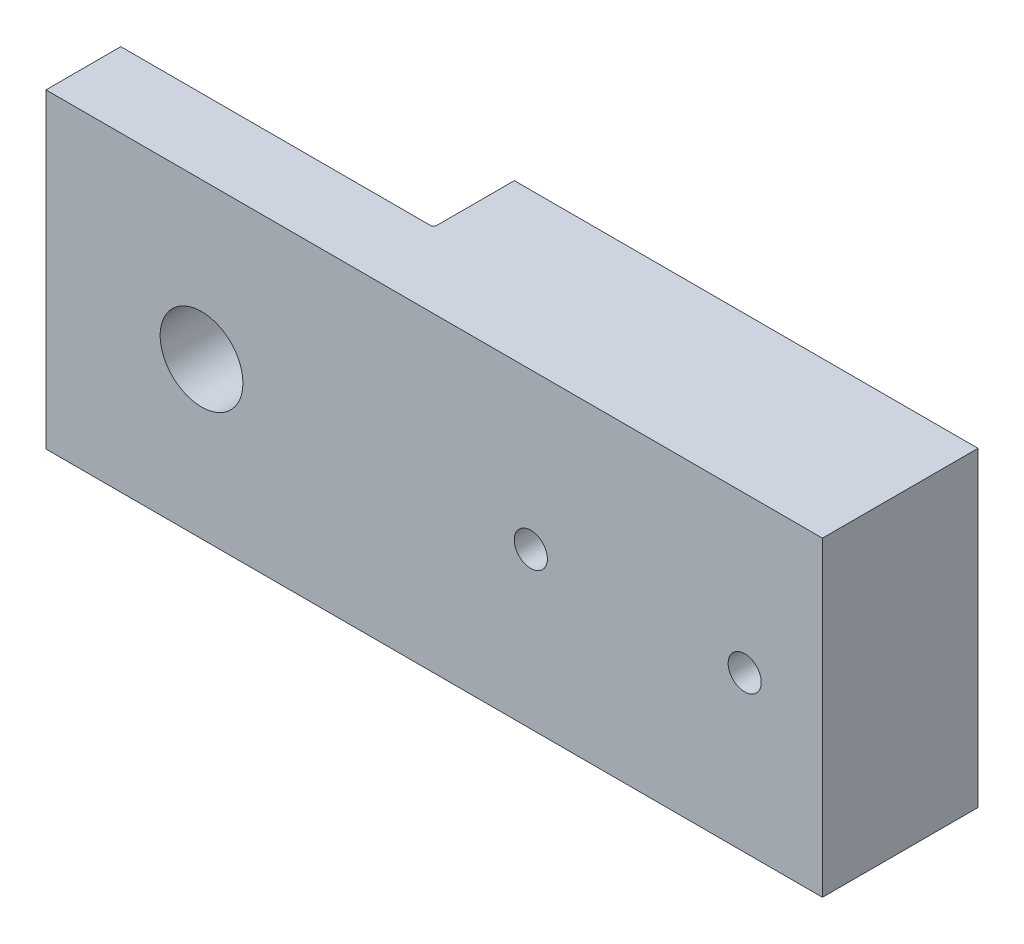
ISO-10303-21;
HEADER;
FILE_DESCRIPTION(('STEP AP214'),'2;1');
FILE_NAME('part.step','',(''),(''),'','','');
FILE_SCHEMA(('AUTOMOTIVE_DESIGN { 1 0 10303 214 1 1 1 1 }'));
ENDSEC;
DATA;
#1=APPLICATION_CONTEXT('core data for automotive mechanical design processes');
#2=APPLICATION_PROTOCOL_DEFINITION('international standard','automotive_design',2000,#1);
#3=PRODUCT_CONTEXT('',#1,'mechanical');
#4=PRODUCT('Part','Part','',(#3));
#5=PRODUCT_RELATED_PRODUCT_CATEGORY('part','',(#4));
#6=PRODUCT_DEFINITION_FORMATION('','',#4);
#7=PRODUCT_DEFINITION_CONTEXT('part definition',#1,'design');
#8=PRODUCT_DEFINITION('design','',#6,#7);
#9=PRODUCT_DEFINITION_SHAPE('','',#8);
#10=(LENGTH_UNIT() NAMED_UNIT(*) SI_UNIT(.MILLI.,.METRE.));
#11=(NAMED_UNIT(*) PLANE_ANGLE_UNIT() SI_UNIT($,.RADIAN.));
#12=(NAMED_UNIT(*) SI_UNIT($,.STERADIAN.) SOLID_ANGLE_UNIT());
#13=UNCERTAINTY_MEASURE_WITH_UNIT(LENGTH_MEASURE(1.E-05),#10,'distance_accuracy_value','');
#14=(GEOMETRIC_REPRESENTATION_CONTEXT(3) GLOBAL_UNCERTAINTY_ASSIGNED_CONTEXT((#13)) GLOBAL_UNIT_ASSIGNED_CONTEXT((#10,
#11,#12)) REPRESENTATION_CONTEXT('',''));
#15=CARTESIAN_POINT('',(0.,0.,0.));
#16=DIRECTION('',(0.,0.,1.));
#17=DIRECTION('',(1.,0.,0.));
#18=AXIS2_PLACEMENT_3D('',#15,#16,#17);
#19=CARTESIAN_POINT('',(-9.55044311816971,0.,6.35));
#20=DIRECTION('',(1.,0.,0.));
#21=DIRECTION('',(0.,1.,0.));
#22=AXIS2_PLACEMENT_3D('',#19,#20,#21);
#23=PLANE('',#22);
#24=DIRECTION('',(0.,1.,0.));
#25=VECTOR('',#24,1.);
#26=CARTESIAN_POINT('',(-9.55044311816977,393.7,0.242852772865731));
#27=LINE('',#26,#25);
#28=CARTESIAN_POINT('',(-9.55044311816977,393.7,0.242852772865731));
#29=VERTEX_POINT('',#28);
#30=CARTESIAN_POINT('',(-9.55044311816977,419.1,0.242852772865731));
#31=VERTEX_POINT('',#30);
#32=EDGE_CURVE('E117',#29,#31,#27,.T.);
#33=ORIENTED_EDGE('',*,*,#32,.F.);
#34=DIRECTION('',(0.,0.,-1.));
#35=VECTOR('',#34,1.);
#36=CARTESIAN_POINT('',(-9.55044311816977,393.7,6.35));
#37=LINE('',#36,#35);
#38=CARTESIAN_POINT('',(-9.55044311816977,393.7,6.35));
#39=VERTEX_POINT('',#38);
#40=EDGE_CURVE('E128',#39,#29,#37,.T.);
#41=ORIENTED_EDGE('',*,*,#40,.F.);
#42=DIRECTION('',(0.,-1.,0.));
#43=VECTOR('',#42,1.);
#44=CARTESIAN_POINT('',(-9.55044311816971,0.,6.35));
#45=LINE('',#44,#43);
#46=CARTESIAN_POINT('',(-9.55044311816977,419.1,6.35));
#47=VERTEX_POINT('',#46);
#48=EDGE_CURVE('E70',#47,#39,#45,.T.);
#49=ORIENTED_EDGE('',*,*,#48,.F.);
#50=DIRECTION('',(0.,0.,-1.));
#51=VECTOR('',#50,1.);
#52=CARTESIAN_POINT('',(-9.55044311816977,419.1,6.35));
#53=LINE('',#52,#51);
#54=EDGE_CURVE('E131',#47,#31,#53,.T.);
#55=ORIENTED_EDGE('',*,*,#54,.T.);
#56=EDGE_LOOP('',(#33,#41,#49,#55));
#57=FACE_BOUND('',#56,.T.);
#58=ADVANCED_FACE('F40',(#57),#23,.F.);
#59=CARTESIAN_POINT('',(0.,393.7,6.35));
#60=DIRECTION('',(0.,1.,0.));
#61=DIRECTION('',(0.,0.,1.));
#62=AXIS2_PLACEMENT_3D('',#59,#60,#61);
#63=PLANE('',#62);
#64=CARTESIAN_POINT('',(15.748,393.7,0.));
#65=DIRECTION('',(0.,1.,0.));
#66=DIRECTION('',(0.,0.,1.));
#67=AXIS2_PLACEMENT_3D('',#64,#65,#66);
#68=CIRCLE('',#67,0.242852772865732);
#69=CARTESIAN_POINT('',(15.9908527728657,393.7,0.));
#70=VERTEX_POINT('',#69);
#71=CARTESIAN_POINT('',(15.748,393.7,0.242852772865731));
#72=VERTEX_POINT('',#71);
#73=EDGE_CURVE('E124',#70,#72,#68,.F.);
#74=ORIENTED_EDGE('',*,*,#73,.F.);
#75=DIRECTION('',(0.,0.,-1.));
#76=VECTOR('',#75,1.);
#77=CARTESIAN_POINT('',(15.9908527728657,393.7,0.));
#78=LINE('',#77,#76);
#79=CARTESIAN_POINT('',(15.9908527728657,393.7,-6.35));
#80=VERTEX_POINT('',#79);
#81=EDGE_CURVE('E133',#70,#80,#78,.T.);
#82=ORIENTED_EDGE('',*,*,#81,.T.);
#83=DIRECTION('',(-1.,0.,0.));
#84=VECTOR('',#83,1.);
#85=CARTESIAN_POINT('',(0.,393.7,-6.35));
#86=LINE('',#85,#84);
#87=CARTESIAN_POINT('',(53.848,393.7,-6.35));
#88=VERTEX_POINT('',#87);
#89=EDGE_CURVE('E171',#88,#80,#86,.T.);
#90=ORIENTED_EDGE('',*,*,#89,.F.);
#91=DIRECTION('',(0.,0.,-1.));
#92=VECTOR('',#91,1.);
#93=CARTESIAN_POINT('',(53.848,393.7,6.35));
#94=LINE('',#93,#92);
#95=CARTESIAN_POINT('',(53.848,393.7,6.35));
#96=VERTEX_POINT('',#95);
#97=EDGE_CURVE('E11',#96,#88,#94,.T.);
#98=ORIENTED_EDGE('',*,*,#97,.F.);
#99=DIRECTION('',(1.,0.,0.));
#100=VECTOR('',#99,1.);
#101=CARTESIAN_POINT('',(0.,393.7,6.35));
#102=LINE('',#101,#100);
#103=EDGE_CURVE('E136',#39,#96,#102,.T.);
#104=ORIENTED_EDGE('',*,*,#103,.F.);
#105=ORIENTED_EDGE('',*,*,#40,.T.);
#106=DIRECTION('',(-1.,0.,0.));
#107=VECTOR('',#106,1.);
#108=CARTESIAN_POINT('',(0.,393.7,0.242852772865731));
#109=LINE('',#108,#107);
#110=EDGE_CURVE('E113',#72,#29,#109,.T.);
#111=ORIENTED_EDGE('',*,*,#110,.F.);
#112=EDGE_LOOP('',(#74,#82,#90,#98,#104,#105,#111));
#113=FACE_BOUND('',#112,.T.);
#114=ADVANCED_FACE('F42',(#113),#63,.F.);
#115=CARTESIAN_POINT('',(53.8479999999999,0.,6.35));
#116=DIRECTION('',(1.,0.,0.));
#117=DIRECTION('',(0.,1.,0.));
#118=AXIS2_PLACEMENT_3D('',#115,#116,#117);
#119=PLANE('',#118);
#120=ORIENTED_EDGE('',*,*,#97,.T.);
#121=DIRECTION('',(0.,-1.,0.));
#122=VECTOR('',#121,1.);
#123=CARTESIAN_POINT('',(53.8479999999999,0.,-6.35));
#124=LINE('',#123,#122);
#125=CARTESIAN_POINT('',(53.848,419.1,-6.35));
#126=VERTEX_POINT('',#125);
#127=EDGE_CURVE('E160',#126,#88,#124,.T.);
#128=ORIENTED_EDGE('',*,*,#127,.F.);
#129=DIRECTION('',(0.,0.,-1.));
#130=VECTOR('',#129,1.);
#131=CARTESIAN_POINT('',(53.848,419.1,6.35));
#132=LINE('',#131,#130);
#133=CARTESIAN_POINT('',(53.848,419.1,6.35));
#134=VERTEX_POINT('',#133);
#135=EDGE_CURVE('E49',#134,#126,#132,.T.);
#136=ORIENTED_EDGE('',*,*,#135,.F.);
#137=DIRECTION('',(0.,-1.,0.));
#138=VECTOR('',#137,1.);
#139=CARTESIAN_POINT('',(53.8479999999999,0.,6.35));
#140=LINE('',#139,#138);
#141=EDGE_CURVE('E168',#134,#96,#140,.T.);
#142=ORIENTED_EDGE('',*,*,#141,.T.);
#143=EDGE_LOOP('',(#120,#128,#136,#142));
#144=FACE_BOUND('',#143,.T.);
#145=ADVANCED_FACE('F161',(#144),#119,.T.);
#146=CARTESIAN_POINT('',(5.63304452072211E-13,419.1,6.35));
#147=DIRECTION('',(0.,-1.,0.));
#148=DIRECTION('',(1.,0.,0.));
#149=AXIS2_PLACEMENT_3D('',#146,#147,#148);
#150=PLANE('',#149);
#151=DIRECTION('',(1.,0.,0.));
#152=VECTOR('',#151,1.);
#153=CARTESIAN_POINT('',(5.63304452072211E-13,419.1,-6.35));
#154=LINE('',#153,#152);
#155=CARTESIAN_POINT('',(15.9908527728657,419.1,-6.35));
#156=VERTEX_POINT('',#155);
#157=EDGE_CURVE('E155',#156,#126,#154,.T.);
#158=ORIENTED_EDGE('',*,*,#157,.F.);
#159=DIRECTION('',(0.,0.,-1.));
#160=VECTOR('',#159,1.);
#161=CARTESIAN_POINT('',(15.9908527728657,419.1,0.));
#162=LINE('',#161,#160);
#163=CARTESIAN_POINT('',(15.9908527728657,419.1,0.));
#164=VERTEX_POINT('',#163);
#165=EDGE_CURVE('E59',#164,#156,#162,.T.);
#166=ORIENTED_EDGE('',*,*,#165,.F.);
#167=CARTESIAN_POINT('',(15.748,419.1,0.));
#168=DIRECTION('',(0.,1.,0.));
#169=DIRECTION('',(0.,0.,1.));
#170=AXIS2_PLACEMENT_3D('',#167,#168,#169);
#171=CIRCLE('',#170,0.242852772865732);
#172=CARTESIAN_POINT('',(15.748,419.1,0.242852772865731));
#173=VERTEX_POINT('',#172);
#174=EDGE_CURVE('E181',#164,#173,#171,.F.);
#175=ORIENTED_EDGE('',*,*,#174,.T.);
#176=DIRECTION('',(-1.,0.,0.));
#177=VECTOR('',#176,1.);
#178=CARTESIAN_POINT('',(0.,419.1,0.242852772865731));
#179=LINE('',#178,#177);
#180=EDGE_CURVE('E179',#173,#31,#179,.T.);
#181=ORIENTED_EDGE('',*,*,#180,.T.);
#182=ORIENTED_EDGE('',*,*,#54,.F.);
#183=DIRECTION('',(-1.,0.,0.));
#184=VECTOR('',#183,1.);
#185=CARTESIAN_POINT('',(5.63304452072211E-13,419.1,6.35));
#186=LINE('',#185,#184);
#187=EDGE_CURVE('E143',#134,#47,#186,.T.);
#188=ORIENTED_EDGE('',*,*,#187,.F.);
#189=ORIENTED_EDGE('',*,*,#135,.T.);
#190=EDGE_LOOP('',(#158,#166,#175,#181,#182,#188,#189));
#191=FACE_BOUND('',#190,.T.);
#192=ADVANCED_FACE('F154',(#191),#150,.F.);
#193=CARTESIAN_POINT('',(0.,0.,6.35));
#194=DIRECTION('',(0.,0.,1.));
#195=DIRECTION('',(1.,0.,0.));
#196=AXIS2_PLACEMENT_3D('',#193,#194,#195);
#197=PLANE('',#196);
#198=CARTESIAN_POINT('',(3.14955688183023,406.4,6.35));
#199=DIRECTION('',(0.,0.,1.));
#200=DIRECTION('',(1.,0.,0.));
#201=AXIS2_PLACEMENT_3D('',#198,#199,#200);
#202=CIRCLE('',#201,3.3782);
#203=CARTESIAN_POINT('',(6.52775688183023,406.4,6.35));
#204=VERTEX_POINT('',#203);
#205=EDGE_CURVE('E224',#204,#204,#202,.T.);
#206=ORIENTED_EDGE('',*,*,#205,.F.);
#207=EDGE_LOOP('',(#206));
#208=FACE_BOUND('',#207,.T.);
#209=CARTESIAN_POINT('',(47.498,406.4,6.35));
#210=DIRECTION('',(0.,0.,1.));
#211=DIRECTION('',(1.,0.,0.));
#212=AXIS2_PLACEMENT_3D('',#209,#210,#211);
#213=CIRCLE('',#212,1.35255);
#214=CARTESIAN_POINT('',(48.85055,406.4,6.35));
#215=VERTEX_POINT('',#214);
#216=EDGE_CURVE('E216',#215,#215,#213,.T.);
#217=ORIENTED_EDGE('',*,*,#216,.F.);
#218=EDGE_LOOP('',(#217));
#219=FACE_BOUND('',#218,.T.);
#220=CARTESIAN_POINT('',(30.0355,406.4,6.35));
#221=DIRECTION('',(0.,0.,1.));
#222=DIRECTION('',(1.,0.,0.));
#223=AXIS2_PLACEMENT_3D('',#220,#221,#222);
#224=CIRCLE('',#223,1.35255);
#225=CARTESIAN_POINT('',(31.38805,406.4,6.35));
#226=VERTEX_POINT('',#225);
#227=EDGE_CURVE('E188',#226,#226,#224,.T.);
#228=ORIENTED_EDGE('',*,*,#227,.F.);
#229=EDGE_LOOP('',(#228));
#230=FACE_BOUND('',#229,.T.);
#231=ORIENTED_EDGE('',*,*,#103,.T.);
#232=ORIENTED_EDGE('',*,*,#141,.F.);
#233=ORIENTED_EDGE('',*,*,#187,.T.);
#234=ORIENTED_EDGE('',*,*,#48,.T.);
#235=EDGE_LOOP('',(#231,#232,#233,#234));
#236=FACE_BOUND('',#235,.T.);
#237=ADVANCED_FACE('F177',(#208,#219,#230,#236),#197,.T.);
#238=CARTESIAN_POINT('',(0.,0.,-6.35));
#239=DIRECTION('',(0.,0.,-1.));
#240=DIRECTION('',(-1.,0.,0.));
#241=AXIS2_PLACEMENT_3D('',#238,#239,#240);
#242=PLANE('',#241);
#243=CARTESIAN_POINT('',(47.498,406.4,-6.35));
#244=DIRECTION('',(0.,0.,-1.));
#245=DIRECTION('',(-1.,0.,0.));
#246=AXIS2_PLACEMENT_3D('',#243,#244,#245);
#247=CIRCLE('',#246,1.35255);
#248=CARTESIAN_POINT('',(46.14545,406.4,-6.35));
#249=VERTEX_POINT('',#248);
#250=EDGE_CURVE('E213',#249,#249,#247,.T.);
#251=ORIENTED_EDGE('',*,*,#250,.F.);
#252=EDGE_LOOP('',(#251));
#253=FACE_BOUND('',#252,.T.);
#254=CARTESIAN_POINT('',(30.0355,406.4,-6.35));
#255=DIRECTION('',(0.,0.,-1.));
#256=DIRECTION('',(-1.,0.,0.));
#257=AXIS2_PLACEMENT_3D('',#254,#255,#256);
#258=CIRCLE('',#257,1.35255);
#259=CARTESIAN_POINT('',(28.68295,406.4,-6.35));
#260=VERTEX_POINT('',#259);
#261=EDGE_CURVE('E183',#260,#260,#258,.T.);
#262=ORIENTED_EDGE('',*,*,#261,.F.);
#263=EDGE_LOOP('',(#262));
#264=FACE_BOUND('',#263,.T.);
#265=DIRECTION('',(0.,1.,0.));
#266=VECTOR('',#265,1.);
#267=CARTESIAN_POINT('',(15.9908527728657,393.7,-6.35));
#268=LINE('',#267,#266);
#269=EDGE_CURVE('E195',#80,#156,#268,.T.);
#270=ORIENTED_EDGE('',*,*,#269,.T.);
#271=ORIENTED_EDGE('',*,*,#157,.T.);
#272=ORIENTED_EDGE('',*,*,#127,.T.);
#273=ORIENTED_EDGE('',*,*,#89,.T.);
#274=EDGE_LOOP('',(#270,#271,#272,#273));
#275=FACE_BOUND('',#274,.T.);
#276=ADVANCED_FACE('F203',(#253,#264,#275),#242,.T.);
#277=CARTESIAN_POINT('',(15.9908527728657,393.7,0.));
#278=DIRECTION('',(1.,0.,0.));
#279=DIRECTION('',(0.,0.,-1.));
#280=AXIS2_PLACEMENT_3D('',#277,#278,#279);
#281=PLANE('',#280);
#282=ORIENTED_EDGE('',*,*,#165,.T.);
#283=ORIENTED_EDGE('',*,*,#269,.F.);
#284=ORIENTED_EDGE('',*,*,#81,.F.);
#285=DIRECTION('',(0.,1.,0.));
#286=VECTOR('',#285,1.);
#287=CARTESIAN_POINT('',(15.9908527728657,393.7,0.));
#288=LINE('',#287,#286);
#289=EDGE_CURVE('E198',#70,#164,#288,.T.);
#290=ORIENTED_EDGE('',*,*,#289,.T.);
#291=EDGE_LOOP('',(#282,#283,#284,#290));
#292=FACE_BOUND('',#291,.T.);
#293=ADVANCED_FACE('F246',(#292),#281,.F.);
#294=CARTESIAN_POINT('',(15.748,393.7,0.));
#295=DIRECTION('',(0.,1.,0.));
#296=DIRECTION('',(0.,0.,1.));
#297=AXIS2_PLACEMENT_3D('',#294,#295,#296);
#298=CYLINDRICAL_SURFACE('',#297,0.242852772865732);
#299=ORIENTED_EDGE('',*,*,#174,.F.);
#300=ORIENTED_EDGE('',*,*,#289,.F.);
#301=ORIENTED_EDGE('',*,*,#73,.T.);
#302=DIRECTION('',(0.,1.,0.));
#303=VECTOR('',#302,1.);
#304=CARTESIAN_POINT('',(15.748,393.7,0.242852772865731));
#305=LINE('',#304,#303);
#306=EDGE_CURVE('E119',#72,#173,#305,.T.);
#307=ORIENTED_EDGE('',*,*,#306,.T.);
#308=EDGE_LOOP('',(#299,#300,#301,#307));
#309=FACE_BOUND('',#308,.T.);
#310=ADVANCED_FACE('F252',(#309),#298,.F.);
#311=CARTESIAN_POINT('',(0.,393.7,0.242852772865731));
#312=DIRECTION('',(0.,0.,-1.));
#313=DIRECTION('',(-1.,0.,0.));
#314=AXIS2_PLACEMENT_3D('',#311,#312,#313);
#315=PLANE('',#314);
#316=CARTESIAN_POINT('',(3.14955688183023,406.4,0.242852772865731));
#317=DIRECTION('',(0.,0.,-1.));
#318=DIRECTION('',(-1.,0.,0.));
#319=AXIS2_PLACEMENT_3D('',#316,#317,#318);
#320=CIRCLE('',#319,3.3782);
#321=CARTESIAN_POINT('',(-0.228643118169766,406.4,0.242852772865731));
#322=VERTEX_POINT('',#321);
#323=EDGE_CURVE('E220',#322,#322,#320,.T.);
#324=ORIENTED_EDGE('',*,*,#323,.F.);
#325=EDGE_LOOP('',(#324));
#326=FACE_BOUND('',#325,.T.);
#327=ORIENTED_EDGE('',*,*,#180,.F.);
#328=ORIENTED_EDGE('',*,*,#306,.F.);
#329=ORIENTED_EDGE('',*,*,#110,.T.);
#330=ORIENTED_EDGE('',*,*,#32,.T.);
#331=EDGE_LOOP('',(#327,#328,#329,#330));
#332=FACE_BOUND('',#331,.T.);
#333=ADVANCED_FACE('F116',(#326,#332),#315,.T.);
#334=CARTESIAN_POINT('',(30.0355,406.4,6.35));
#335=DIRECTION('',(0.,0.,1.));
#336=DIRECTION('',(1.,0.,0.));
#337=AXIS2_PLACEMENT_3D('',#334,#335,#336);
#338=CYLINDRICAL_SURFACE('',#337,1.35255);
#339=ORIENTED_EDGE('',*,*,#227,.T.);
#340=EDGE_LOOP('',(#339));
#341=FACE_BOUND('',#340,.T.);
#342=ORIENTED_EDGE('',*,*,#261,.T.);
#343=EDGE_LOOP('',(#342));
#344=FACE_BOUND('',#343,.T.);
#345=ADVANCED_FACE('F238',(#341,#344),#338,.F.);
#346=CARTESIAN_POINT('',(47.498,406.4,6.35));
#347=DIRECTION('',(0.,0.,1.));
#348=DIRECTION('',(1.,0.,0.));
#349=AXIS2_PLACEMENT_3D('',#346,#347,#348);
#350=CYLINDRICAL_SURFACE('',#349,1.35255);
#351=ORIENTED_EDGE('',*,*,#216,.T.);
#352=EDGE_LOOP('',(#351));
#353=FACE_BOUND('',#352,.T.);
#354=ORIENTED_EDGE('',*,*,#250,.T.);
#355=EDGE_LOOP('',(#354));
#356=FACE_BOUND('',#355,.T.);
#357=ADVANCED_FACE('F241',(#353,#356),#350,.F.);
#358=CARTESIAN_POINT('',(3.14955688183023,406.4,6.35));
#359=DIRECTION('',(0.,0.,1.));
#360=DIRECTION('',(1.,0.,0.));
#361=AXIS2_PLACEMENT_3D('',#358,#359,#360);
#362=CYLINDRICAL_SURFACE('',#361,3.3782);
#363=ORIENTED_EDGE('',*,*,#205,.T.);
#364=EDGE_LOOP('',(#363));
#365=FACE_BOUND('',#364,.T.);
#366=ORIENTED_EDGE('',*,*,#323,.T.);
#367=EDGE_LOOP('',(#366));
#368=FACE_BOUND('',#367,.T.);
#369=ADVANCED_FACE('F228',(#365,#368),#362,.F.);
#370=CLOSED_SHELL('',(#58,#114,#145,#192,#237,#276,#293,#310,#333,#345,#357,#369));
#371=MANIFOLD_SOLID_BREP('B2',#370);
#372=ADVANCED_BREP_SHAPE_REPRESENTATION('',(#18,#371),#14);
#373=SHAPE_DEFINITION_REPRESENTATION(#9,#372);
ENDSEC;
END-ISO-10303-21;
